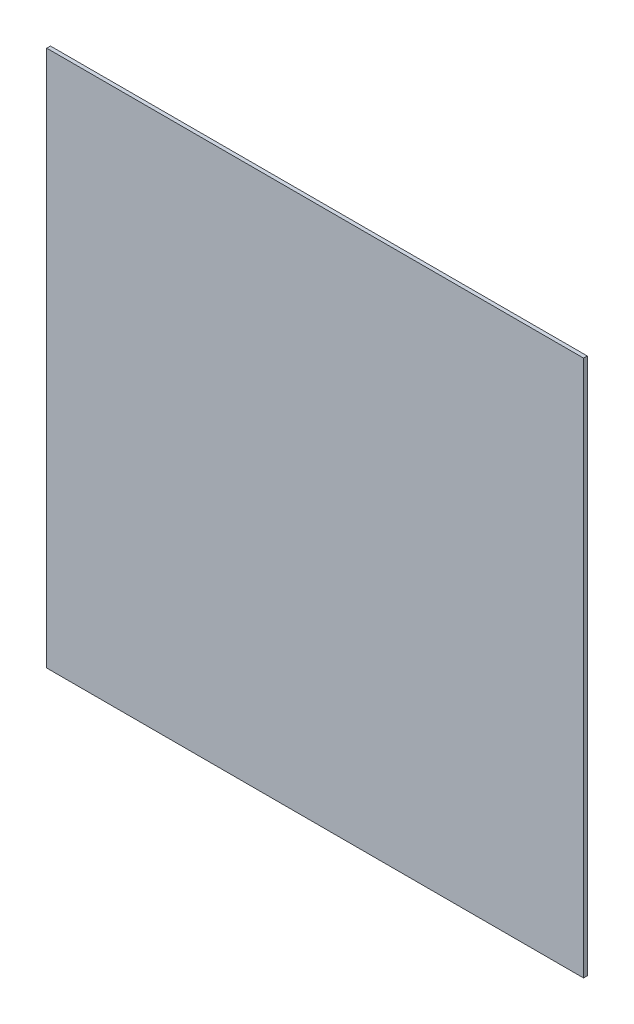
ISO-10303-21;
HEADER;
FILE_DESCRIPTION(('STEP AP214'),'2;1');
FILE_NAME('part.step','',(''),(''),'','','');
FILE_SCHEMA(('AUTOMOTIVE_DESIGN { 1 0 10303 214 1 1 1 1 }'));
ENDSEC;
DATA;
#1=APPLICATION_CONTEXT('core data for automotive mechanical design processes');
#2=APPLICATION_PROTOCOL_DEFINITION('international standard','automotive_design',2000,#1);
#3=PRODUCT_CONTEXT('',#1,'mechanical');
#4=PRODUCT('Part','Part','',(#3));
#5=PRODUCT_RELATED_PRODUCT_CATEGORY('part','',(#4));
#6=PRODUCT_DEFINITION_FORMATION('','',#4);
#7=PRODUCT_DEFINITION_CONTEXT('part definition',#1,'design');
#8=PRODUCT_DEFINITION('design','',#6,#7);
#9=PRODUCT_DEFINITION_SHAPE('','',#8);
#10=(LENGTH_UNIT() NAMED_UNIT(*) SI_UNIT(.MILLI.,.METRE.));
#11=(NAMED_UNIT(*) PLANE_ANGLE_UNIT() SI_UNIT($,.RADIAN.));
#12=(NAMED_UNIT(*) SI_UNIT($,.STERADIAN.) SOLID_ANGLE_UNIT());
#13=UNCERTAINTY_MEASURE_WITH_UNIT(LENGTH_MEASURE(1.E-05),#10,'distance_accuracy_value','');
#14=(GEOMETRIC_REPRESENTATION_CONTEXT(3) GLOBAL_UNCERTAINTY_ASSIGNED_CONTEXT((#13)) GLOBAL_UNIT_ASSIGNED_CONTEXT((#10,
#11,#12)) REPRESENTATION_CONTEXT('',''));
#15=CARTESIAN_POINT('',(0.,0.,0.));
#16=DIRECTION('',(0.,0.,1.));
#17=DIRECTION('',(1.,0.,0.));
#18=AXIS2_PLACEMENT_3D('',#15,#16,#17);
#19=CARTESIAN_POINT('',(457.2,457.2,6.35));
#20=DIRECTION('',(-1.,0.,0.));
#21=DIRECTION('',(0.,-1.,0.));
#22=AXIS2_PLACEMENT_3D('',#19,#20,#21);
#23=PLANE('',#22);
#24=DIRECTION('',(0.,1.,0.));
#25=VECTOR('',#24,1.);
#26=CARTESIAN_POINT('',(457.2,457.2,0.));
#27=LINE('',#26,#25);
#28=CARTESIAN_POINT('',(457.2,-457.2,0.));
#29=VERTEX_POINT('',#28);
#30=CARTESIAN_POINT('',(457.2,457.2,0.));
#31=VERTEX_POINT('',#30);
#32=EDGE_CURVE('E113',#29,#31,#27,.T.);
#33=ORIENTED_EDGE('',*,*,#32,.T.);
#34=DIRECTION('',(0.,0.,-1.));
#35=VECTOR('',#34,1.);
#36=CARTESIAN_POINT('',(457.2,457.2,6.35));
#37=LINE('',#36,#35);
#38=CARTESIAN_POINT('',(457.2,457.2,6.35));
#39=VERTEX_POINT('',#38);
#40=EDGE_CURVE('E11',#39,#31,#37,.T.);
#41=ORIENTED_EDGE('',*,*,#40,.F.);
#42=DIRECTION('',(0.,1.,0.));
#43=VECTOR('',#42,1.);
#44=CARTESIAN_POINT('',(457.2,457.2,6.35));
#45=LINE('',#44,#43);
#46=CARTESIAN_POINT('',(457.2,-457.2,6.35));
#47=VERTEX_POINT('',#46);
#48=EDGE_CURVE('E97',#47,#39,#45,.T.);
#49=ORIENTED_EDGE('',*,*,#48,.F.);
#50=DIRECTION('',(0.,0.,-1.));
#51=VECTOR('',#50,1.);
#52=CARTESIAN_POINT('',(457.2,-457.2,6.35));
#53=LINE('',#52,#51);
#54=EDGE_CURVE('E109',#47,#29,#53,.T.);
#55=ORIENTED_EDGE('',*,*,#54,.T.);
#56=EDGE_LOOP('',(#33,#41,#49,#55));
#57=FACE_BOUND('',#56,.T.);
#58=ADVANCED_FACE('F45',(#57),#23,.F.);
#59=CARTESIAN_POINT('',(-457.2,457.2,6.35));
#60=DIRECTION('',(0.,-1.,0.));
#61=DIRECTION('',(0.,0.,-1.));
#62=AXIS2_PLACEMENT_3D('',#59,#60,#61);
#63=PLANE('',#62);
#64=DIRECTION('',(-1.,0.,0.));
#65=VECTOR('',#64,1.);
#66=CARTESIAN_POINT('',(-457.2,457.2,0.));
#67=LINE('',#66,#65);
#68=CARTESIAN_POINT('',(-457.2,457.2,0.));
#69=VERTEX_POINT('',#68);
#70=EDGE_CURVE('E102',#31,#69,#67,.T.);
#71=ORIENTED_EDGE('',*,*,#70,.T.);
#72=DIRECTION('',(0.,0.,-1.));
#73=VECTOR('',#72,1.);
#74=CARTESIAN_POINT('',(-457.2,457.2,6.35));
#75=LINE('',#74,#73);
#76=CARTESIAN_POINT('',(-457.2,457.2,6.35));
#77=VERTEX_POINT('',#76);
#78=EDGE_CURVE('E54',#77,#69,#75,.T.);
#79=ORIENTED_EDGE('',*,*,#78,.F.);
#80=DIRECTION('',(-1.,0.,0.));
#81=VECTOR('',#80,1.);
#82=CARTESIAN_POINT('',(-457.2,457.2,6.35));
#83=LINE('',#82,#81);
#84=EDGE_CURVE('E92',#39,#77,#83,.T.);
#85=ORIENTED_EDGE('',*,*,#84,.F.);
#86=ORIENTED_EDGE('',*,*,#40,.T.);
#87=EDGE_LOOP('',(#71,#79,#85,#86));
#88=FACE_BOUND('',#87,.T.);
#89=ADVANCED_FACE('F101',(#88),#63,.F.);
#90=CARTESIAN_POINT('',(-457.2,457.2,6.35));
#91=DIRECTION('',(1.,0.,0.));
#92=DIRECTION('',(0.,1.,0.));
#93=AXIS2_PLACEMENT_3D('',#90,#91,#92);
#94=PLANE('',#93);
#95=DIRECTION('',(0.,-1.,0.));
#96=VECTOR('',#95,1.);
#97=CARTESIAN_POINT('',(-457.2,457.2,0.));
#98=LINE('',#97,#96);
#99=CARTESIAN_POINT('',(-457.2,-457.2,0.));
#100=VERTEX_POINT('',#99);
#101=EDGE_CURVE('E79',#69,#100,#98,.T.);
#102=ORIENTED_EDGE('',*,*,#101,.T.);
#103=DIRECTION('',(0.,0.,-1.));
#104=VECTOR('',#103,1.);
#105=CARTESIAN_POINT('',(-457.2,-457.2,6.35));
#106=LINE('',#105,#104);
#107=CARTESIAN_POINT('',(-457.2,-457.2,6.35));
#108=VERTEX_POINT('',#107);
#109=EDGE_CURVE('E104',#108,#100,#106,.T.);
#110=ORIENTED_EDGE('',*,*,#109,.F.);
#111=DIRECTION('',(0.,-1.,0.));
#112=VECTOR('',#111,1.);
#113=CARTESIAN_POINT('',(-457.2,457.2,6.35));
#114=LINE('',#113,#112);
#115=EDGE_CURVE('E95',#77,#108,#114,.T.);
#116=ORIENTED_EDGE('',*,*,#115,.F.);
#117=ORIENTED_EDGE('',*,*,#78,.T.);
#118=EDGE_LOOP('',(#102,#110,#116,#117));
#119=FACE_BOUND('',#118,.T.);
#120=ADVANCED_FACE('F105',(#119),#94,.F.);
#121=CARTESIAN_POINT('',(-457.2,-457.2,6.35));
#122=DIRECTION('',(0.,1.,0.));
#123=DIRECTION('',(0.,0.,1.));
#124=AXIS2_PLACEMENT_3D('',#121,#122,#123);
#125=PLANE('',#124);
#126=DIRECTION('',(1.,0.,0.));
#127=VECTOR('',#126,1.);
#128=CARTESIAN_POINT('',(-457.2,-457.2,0.));
#129=LINE('',#128,#127);
#130=EDGE_CURVE('E85',#100,#29,#129,.T.);
#131=ORIENTED_EDGE('',*,*,#130,.T.);
#132=ORIENTED_EDGE('',*,*,#54,.F.);
#133=DIRECTION('',(1.,0.,0.));
#134=VECTOR('',#133,1.);
#135=CARTESIAN_POINT('',(-457.2,-457.2,6.35));
#136=LINE('',#135,#134);
#137=EDGE_CURVE('E62',#108,#47,#136,.T.);
#138=ORIENTED_EDGE('',*,*,#137,.F.);
#139=ORIENTED_EDGE('',*,*,#109,.T.);
#140=EDGE_LOOP('',(#131,#132,#138,#139));
#141=FACE_BOUND('',#140,.T.);
#142=ADVANCED_FACE('F126',(#141),#125,.F.);
#143=CARTESIAN_POINT('',(0.,0.,6.35));
#144=DIRECTION('',(0.,0.,1.));
#145=DIRECTION('',(1.,0.,0.));
#146=AXIS2_PLACEMENT_3D('',#143,#144,#145);
#147=PLANE('',#146);
#148=ORIENTED_EDGE('',*,*,#48,.T.);
#149=ORIENTED_EDGE('',*,*,#84,.T.);
#150=ORIENTED_EDGE('',*,*,#115,.T.);
#151=ORIENTED_EDGE('',*,*,#137,.T.);
#152=EDGE_LOOP('',(#148,#149,#150,#151));
#153=FACE_BOUND('',#152,.T.);
#154=ADVANCED_FACE('F93',(#153),#147,.T.);
#155=CARTESIAN_POINT('',(0.,0.,0.));
#156=DIRECTION('',(0.,0.,1.));
#157=DIRECTION('',(1.,0.,0.));
#158=AXIS2_PLACEMENT_3D('',#155,#156,#157);
#159=PLANE('',#158);
#160=ORIENTED_EDGE('',*,*,#32,.F.);
#161=ORIENTED_EDGE('',*,*,#130,.F.);
#162=ORIENTED_EDGE('',*,*,#101,.F.);
#163=ORIENTED_EDGE('',*,*,#70,.F.);
#164=EDGE_LOOP('',(#160,#161,#162,#163));
#165=FACE_BOUND('',#164,.T.);
#166=ADVANCED_FACE('F129',(#165),#159,.F.);
#167=CLOSED_SHELL('',(#58,#89,#120,#142,#154,#166));
#168=MANIFOLD_SOLID_BREP('B2',#167);
#169=ADVANCED_BREP_SHAPE_REPRESENTATION('',(#18,#168),#14);
#170=SHAPE_DEFINITION_REPRESENTATION(#9,#169);
ENDSEC;
END-ISO-10303-21;
